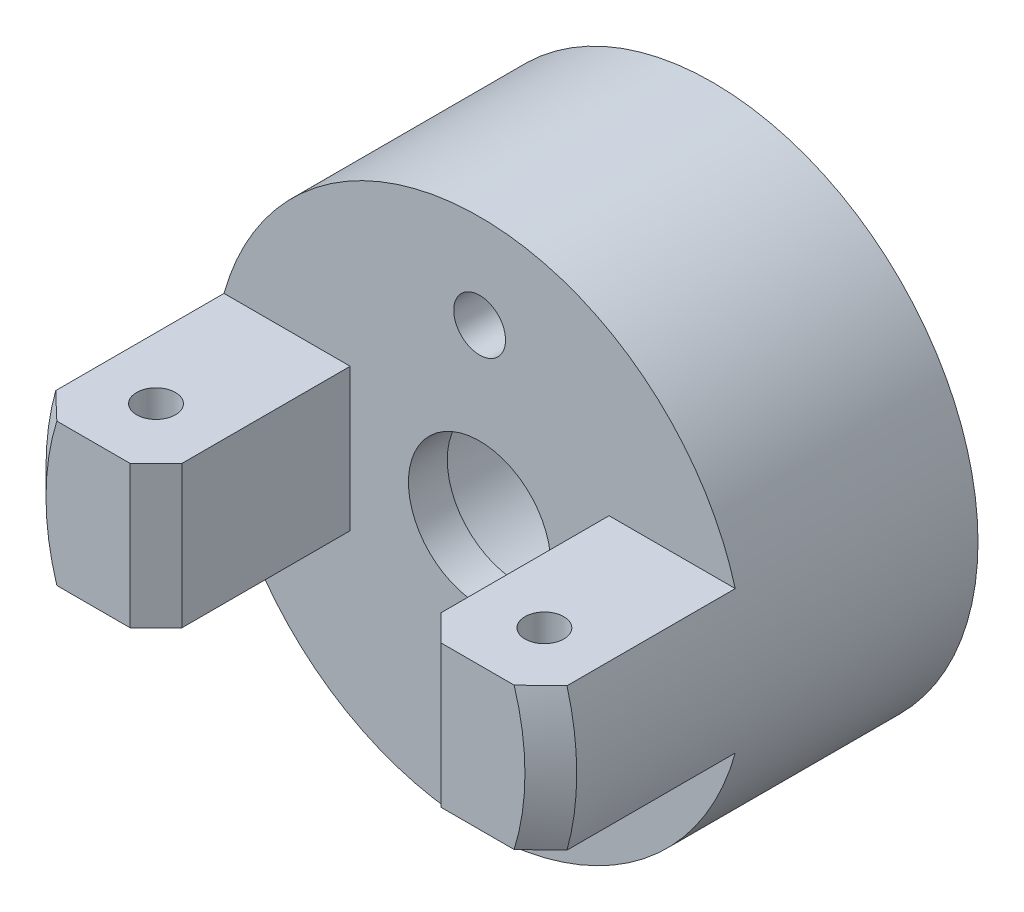
ISO-10303-21;
HEADER;
FILE_DESCRIPTION(('STEP AP214'),'2;1');
FILE_NAME('part.step','',(''),(''),'','','');
FILE_SCHEMA(('AUTOMOTIVE_DESIGN { 1 0 10303 214 1 1 1 1 }'));
ENDSEC;
DATA;
#1=APPLICATION_CONTEXT('core data for automotive mechanical design processes');
#2=APPLICATION_PROTOCOL_DEFINITION('international standard','automotive_design',2000,#1);
#3=PRODUCT_CONTEXT('',#1,'mechanical');
#4=PRODUCT('Part','Part','',(#3));
#5=PRODUCT_RELATED_PRODUCT_CATEGORY('part','',(#4));
#6=PRODUCT_DEFINITION_FORMATION('','',#4);
#7=PRODUCT_DEFINITION_CONTEXT('part definition',#1,'design');
#8=PRODUCT_DEFINITION('design','',#6,#7);
#9=PRODUCT_DEFINITION_SHAPE('','',#8);
#10=(LENGTH_UNIT() NAMED_UNIT(*) SI_UNIT(.MILLI.,.METRE.));
#11=(NAMED_UNIT(*) PLANE_ANGLE_UNIT() SI_UNIT($,.RADIAN.));
#12=(NAMED_UNIT(*) SI_UNIT($,.STERADIAN.) SOLID_ANGLE_UNIT());
#13=UNCERTAINTY_MEASURE_WITH_UNIT(LENGTH_MEASURE(1.E-05),#10,'distance_accuracy_value','');
#14=(GEOMETRIC_REPRESENTATION_CONTEXT(3) GLOBAL_UNCERTAINTY_ASSIGNED_CONTEXT((#13)) GLOBAL_UNIT_ASSIGNED_CONTEXT((#10,
#11,#12)) REPRESENTATION_CONTEXT('',''));
#15=CARTESIAN_POINT('',(0.,0.,0.));
#16=DIRECTION('',(0.,0.,1.));
#17=DIRECTION('',(1.,0.,0.));
#18=AXIS2_PLACEMENT_3D('',#15,#16,#17);
#19=CARTESIAN_POINT('',(0.,0.,0.));
#20=DIRECTION('',(0.,0.,1.));
#21=DIRECTION('',(1.,0.,0.));
#22=AXIS2_PLACEMENT_3D('',#19,#20,#21);
#23=CYLINDRICAL_SURFACE('',#22,5.5);
#24=CARTESIAN_POINT('',(0.,0.,18.));
#25=DIRECTION('',(0.,0.,1.));
#26=DIRECTION('',(1.,0.,0.));
#27=AXIS2_PLACEMENT_3D('',#24,#25,#26);
#28=CIRCLE('',#27,5.5);
#29=CARTESIAN_POINT('',(5.5,0.,18.));
#30=VERTEX_POINT('',#29);
#31=EDGE_CURVE('E339',#30,#30,#28,.T.);
#32=ORIENTED_EDGE('',*,*,#31,.T.);
#33=EDGE_LOOP('',(#32));
#34=FACE_BOUND('',#33,.T.);
#35=CARTESIAN_POINT('',(0.,0.,15.));
#36=DIRECTION('',(0.,0.,-1.));
#37=DIRECTION('',(-1.,0.,0.));
#38=AXIS2_PLACEMENT_3D('',#35,#36,#37);
#39=CIRCLE('',#38,5.5);
#40=CARTESIAN_POINT('',(-5.5,0.,15.));
#41=VERTEX_POINT('',#40);
#42=EDGE_CURVE('E38',#41,#41,#39,.F.);
#43=ORIENTED_EDGE('',*,*,#42,.F.);
#44=EDGE_LOOP('',(#43));
#45=FACE_BOUND('',#44,.T.);
#46=ADVANCED_FACE('F34',(#34,#45),#23,.F.);
#47=CARTESIAN_POINT('',(0.,0.,33.));
#48=DIRECTION('',(0.,0.,1.));
#49=DIRECTION('',(1.,0.,0.));
#50=AXIS2_PLACEMENT_3D('',#47,#48,#49);
#51=PLANE('',#50);
#52=DIRECTION('',(-1.,0.,0.));
#53=VECTOR('',#52,1.);
#54=CARTESIAN_POINT('',(0.,-5.5,33.));
#55=LINE('',#54,#53);
#56=CARTESIAN_POINT('',(17.6635217326557,-5.5,33.));
#57=VERTEX_POINT('',#56);
#58=CARTESIAN_POINT('',(12.,-5.5,33.));
#59=VERTEX_POINT('',#58);
#60=EDGE_CURVE('E188',#57,#59,#55,.T.);
#61=ORIENTED_EDGE('',*,*,#60,.F.);
#62=CARTESIAN_POINT('',(0.,0.,33.));
#63=DIRECTION('',(0.,0.,1.));
#64=DIRECTION('',(1.,0.,0.));
#65=AXIS2_PLACEMENT_3D('',#62,#63,#64);
#66=CIRCLE('',#65,18.5);
#67=CARTESIAN_POINT('',(17.6635217326557,5.5,33.));
#68=VERTEX_POINT('',#67);
#69=EDGE_CURVE('E196',#57,#68,#66,.T.);
#70=ORIENTED_EDGE('',*,*,#69,.T.);
#71=DIRECTION('',(1.,0.,0.));
#72=VECTOR('',#71,1.);
#73=CARTESIAN_POINT('',(10.,5.5,33.));
#74=LINE('',#73,#72);
#75=CARTESIAN_POINT('',(12.,5.5,33.));
#76=VERTEX_POINT('',#75);
#77=EDGE_CURVE('E138',#76,#68,#74,.T.);
#78=ORIENTED_EDGE('',*,*,#77,.F.);
#79=DIRECTION('',(0.,-1.,0.));
#80=VECTOR('',#79,1.);
#81=CARTESIAN_POINT('',(12.,-5.5,33.));
#82=LINE('',#81,#80);
#83=EDGE_CURVE('E194',#76,#59,#82,.T.);
#84=ORIENTED_EDGE('',*,*,#83,.T.);
#85=EDGE_LOOP('',(#61,#70,#78,#84));
#86=FACE_BOUND('',#85,.T.);
#87=ADVANCED_FACE('F275',(#86),#51,.T.);
#88=CARTESIAN_POINT('',(0.,0.,33.));
#89=DIRECTION('',(0.,0.,-1.));
#90=DIRECTION('',(-1.,0.,0.));
#91=AXIS2_PLACEMENT_3D('',#88,#89,#90);
#92=CYLINDRICAL_SURFACE('',#91,20.5);
#93=DIRECTION('',(0.,0.,-1.));
#94=VECTOR('',#93,1.);
#95=CARTESIAN_POINT('',(19.7484176581315,5.5,33.));
#96=LINE('',#95,#94);
#97=CARTESIAN_POINT('',(19.7484176581315,5.5,18.));
#98=VERTEX_POINT('',#97);
#99=CARTESIAN_POINT('',(19.7484176581315,5.5,31.));
#100=VERTEX_POINT('',#99);
#101=EDGE_CURVE('E180',#98,#100,#96,.F.);
#102=ORIENTED_EDGE('',*,*,#101,.T.);
#103=CARTESIAN_POINT('',(0.,0.,31.));
#104=DIRECTION('',(0.,0.,1.));
#105=DIRECTION('',(1.,0.,0.));
#106=AXIS2_PLACEMENT_3D('',#103,#104,#105);
#107=CIRCLE('',#106,20.5);
#108=CARTESIAN_POINT('',(19.7484176581315,-5.5,31.));
#109=VERTEX_POINT('',#108);
#110=EDGE_CURVE('E505',#100,#109,#107,.F.);
#111=ORIENTED_EDGE('',*,*,#110,.T.);
#112=DIRECTION('',(0.,0.,-1.));
#113=VECTOR('',#112,1.);
#114=CARTESIAN_POINT('',(19.7484176581315,-5.5,33.));
#115=LINE('',#114,#113);
#116=CARTESIAN_POINT('',(19.7484176581315,-5.5,18.));
#117=VERTEX_POINT('',#116);
#118=EDGE_CURVE('E178',#109,#117,#115,.T.);
#119=ORIENTED_EDGE('',*,*,#118,.T.);
#120=CARTESIAN_POINT('',(0.,0.,18.));
#121=DIRECTION('',(0.,0.,1.));
#122=DIRECTION('',(1.,0.,0.));
#123=AXIS2_PLACEMENT_3D('',#120,#121,#122);
#124=CIRCLE('',#123,20.5);
#125=CARTESIAN_POINT('',(-19.7484176581315,-5.5,18.));
#126=VERTEX_POINT('',#125);
#127=EDGE_CURVE('E191',#126,#117,#124,.T.);
#128=ORIENTED_EDGE('',*,*,#127,.F.);
#129=DIRECTION('',(0.,0.,-1.));
#130=VECTOR('',#129,1.);
#131=CARTESIAN_POINT('',(-19.7484176581315,-5.5,33.));
#132=LINE('',#131,#130);
#133=CARTESIAN_POINT('',(-19.7484176581315,-5.5,31.));
#134=VERTEX_POINT('',#133);
#135=EDGE_CURVE('E175',#126,#134,#132,.F.);
#136=ORIENTED_EDGE('',*,*,#135,.T.);
#137=CARTESIAN_POINT('',(0.,0.,31.));
#138=DIRECTION('',(0.,0.,1.));
#139=DIRECTION('',(1.,0.,0.));
#140=AXIS2_PLACEMENT_3D('',#137,#138,#139);
#141=CIRCLE('',#140,20.5);
#142=CARTESIAN_POINT('',(-19.7484176581315,5.5,31.));
#143=VERTEX_POINT('',#142);
#144=EDGE_CURVE('E208',#134,#143,#141,.F.);
#145=ORIENTED_EDGE('',*,*,#144,.T.);
#146=DIRECTION('',(0.,0.,-1.));
#147=VECTOR('',#146,1.);
#148=CARTESIAN_POINT('',(-19.7484176581315,5.5,33.));
#149=LINE('',#148,#147);
#150=CARTESIAN_POINT('',(-19.7484176581315,5.5,18.));
#151=VERTEX_POINT('',#150);
#152=EDGE_CURVE('E169',#143,#151,#149,.T.);
#153=ORIENTED_EDGE('',*,*,#152,.T.);
#154=EDGE_CURVE('E136',#98,#151,#124,.T.);
#155=ORIENTED_EDGE('',*,*,#154,.F.);
#156=EDGE_LOOP('',(#102,#111,#119,#128,#136,#145,#153,#155));
#157=FACE_BOUND('',#156,.T.);
#158=CARTESIAN_POINT('',(0.,0.,0.));
#159=DIRECTION('',(0.,0.,1.));
#160=DIRECTION('',(1.,0.,0.));
#161=AXIS2_PLACEMENT_3D('',#158,#159,#160);
#162=CIRCLE('',#161,20.5);
#163=CARTESIAN_POINT('',(20.5,0.,0.));
#164=VERTEX_POINT('',#163);
#165=EDGE_CURVE('E183',#164,#164,#162,.T.);
#166=ORIENTED_EDGE('',*,*,#165,.T.);
#167=EDGE_LOOP('',(#166));
#168=FACE_BOUND('',#167,.T.);
#169=ADVANCED_FACE('F273',(#157,#168),#92,.T.);
#170=DIRECTION('',(1.,0.,0.));
#171=VECTOR('',#170,1.);
#172=CARTESIAN_POINT('',(0.,5.5,33.));
#173=LINE('',#172,#171);
#174=CARTESIAN_POINT('',(-17.6635217326557,5.5,33.));
#175=VERTEX_POINT('',#174);
#176=CARTESIAN_POINT('',(-12.,5.5,33.));
#177=VERTEX_POINT('',#176);
#178=EDGE_CURVE('E186',#175,#177,#173,.T.);
#179=ORIENTED_EDGE('',*,*,#178,.F.);
#180=CARTESIAN_POINT('',(0.,0.,33.));
#181=DIRECTION('',(0.,0.,1.));
#182=DIRECTION('',(1.,0.,0.));
#183=AXIS2_PLACEMENT_3D('',#180,#181,#182);
#184=CIRCLE('',#183,18.5);
#185=CARTESIAN_POINT('',(-17.6635217326557,-5.5,33.));
#186=VERTEX_POINT('',#185);
#187=EDGE_CURVE('E243',#175,#186,#184,.T.);
#188=ORIENTED_EDGE('',*,*,#187,.T.);
#189=DIRECTION('',(-1.,0.,0.));
#190=VECTOR('',#189,1.);
#191=CARTESIAN_POINT('',(-25.1522951522951,-5.5,33.));
#192=LINE('',#191,#190);
#193=CARTESIAN_POINT('',(-12.,-5.5,33.));
#194=VERTEX_POINT('',#193);
#195=EDGE_CURVE('E160',#194,#186,#192,.T.);
#196=ORIENTED_EDGE('',*,*,#195,.F.);
#197=DIRECTION('',(0.,1.,0.));
#198=VECTOR('',#197,1.);
#199=CARTESIAN_POINT('',(-12.,5.5,33.));
#200=LINE('',#199,#198);
#201=EDGE_CURVE('E240',#194,#177,#200,.T.);
#202=ORIENTED_EDGE('',*,*,#201,.T.);
#203=EDGE_LOOP('',(#179,#188,#196,#202));
#204=FACE_BOUND('',#203,.T.);
#205=ADVANCED_FACE('F269',(#204),#51,.T.);
#206=CARTESIAN_POINT('',(0.,0.,0.));
#207=DIRECTION('',(0.,0.,1.));
#208=DIRECTION('',(1.,0.,0.));
#209=AXIS2_PLACEMENT_3D('',#206,#207,#208);
#210=PLANE('',#209);
#211=CARTESIAN_POINT('',(0.,0.,0.));
#212=DIRECTION('',(0.,0.,-1.));
#213=DIRECTION('',(-1.,0.,0.));
#214=AXIS2_PLACEMENT_3D('',#211,#212,#213);
#215=CIRCLE('',#214,7.5);
#216=CARTESIAN_POINT('',(-7.5,0.,0.));
#217=VERTEX_POINT('',#216);
#218=EDGE_CURVE('E341',#217,#217,#215,.T.);
#219=ORIENTED_EDGE('',*,*,#218,.F.);
#220=EDGE_LOOP('',(#219));
#221=FACE_BOUND('',#220,.T.);
#222=CARTESIAN_POINT('',(0.,-13.25,0.));
#223=DIRECTION('',(0.,0.,1.));
#224=DIRECTION('',(1.,0.,0.));
#225=AXIS2_PLACEMENT_3D('',#222,#223,#224);
#226=CIRCLE('',#225,2.);
#227=CARTESIAN_POINT('',(2.,-13.25,0.));
#228=VERTEX_POINT('',#227);
#229=EDGE_CURVE('E321',#228,#228,#226,.T.);
#230=ORIENTED_EDGE('',*,*,#229,.T.);
#231=EDGE_LOOP('',(#230));
#232=FACE_BOUND('',#231,.T.);
#233=CARTESIAN_POINT('',(0.,13.25,0.));
#234=DIRECTION('',(0.,0.,1.));
#235=DIRECTION('',(1.,0.,0.));
#236=AXIS2_PLACEMENT_3D('',#233,#234,#235);
#237=CIRCLE('',#236,2.);
#238=CARTESIAN_POINT('',(2.,13.25,0.));
#239=VERTEX_POINT('',#238);
#240=EDGE_CURVE('E163',#239,#239,#237,.T.);
#241=ORIENTED_EDGE('',*,*,#240,.T.);
#242=EDGE_LOOP('',(#241));
#243=FACE_BOUND('',#242,.T.);
#244=ORIENTED_EDGE('',*,*,#165,.F.);
#245=EDGE_LOOP('',(#244));
#246=FACE_BOUND('',#245,.T.);
#247=ADVANCED_FACE('F272',(#221,#232,#243,#246),#210,.F.);
#248=CARTESIAN_POINT('',(-29.056757359865,-27.5157232704402,18.));
#249=DIRECTION('',(0.,0.,1.));
#250=DIRECTION('',(1.,0.,0.));
#251=AXIS2_PLACEMENT_3D('',#248,#249,#250);
#252=PLANE('',#251);
#253=ORIENTED_EDGE('',*,*,#31,.F.);
#254=EDGE_LOOP('',(#253));
#255=FACE_BOUND('',#254,.T.);
#256=CARTESIAN_POINT('',(0.,-13.25,18.));
#257=DIRECTION('',(0.,0.,1.));
#258=DIRECTION('',(1.,0.,0.));
#259=AXIS2_PLACEMENT_3D('',#256,#257,#258);
#260=CIRCLE('',#259,2.);
#261=CARTESIAN_POINT('',(2.,-13.25,18.));
#262=VERTEX_POINT('',#261);
#263=EDGE_CURVE('E324',#262,#262,#260,.T.);
#264=ORIENTED_EDGE('',*,*,#263,.F.);
#265=EDGE_LOOP('',(#264));
#266=FACE_BOUND('',#265,.T.);
#267=CARTESIAN_POINT('',(0.,13.25,18.));
#268=DIRECTION('',(0.,0.,1.));
#269=DIRECTION('',(1.,0.,0.));
#270=AXIS2_PLACEMENT_3D('',#267,#268,#269);
#271=CIRCLE('',#270,2.);
#272=CARTESIAN_POINT('',(2.,13.25,18.));
#273=VERTEX_POINT('',#272);
#274=EDGE_CURVE('E319',#273,#273,#271,.T.);
#275=ORIENTED_EDGE('',*,*,#274,.F.);
#276=EDGE_LOOP('',(#275));
#277=FACE_BOUND('',#276,.T.);
#278=ORIENTED_EDGE('',*,*,#154,.T.);
#279=DIRECTION('',(1.,0.,0.));
#280=VECTOR('',#279,1.);
#281=CARTESIAN_POINT('',(-29.056757359865,5.5,18.));
#282=LINE('',#281,#280);
#283=CARTESIAN_POINT('',(-10.,5.5,18.));
#284=VERTEX_POINT('',#283);
#285=EDGE_CURVE('E129',#151,#284,#282,.T.);
#286=ORIENTED_EDGE('',*,*,#285,.T.);
#287=DIRECTION('',(0.,-1.,0.));
#288=VECTOR('',#287,1.);
#289=CARTESIAN_POINT('',(-10.,5.5,18.));
#290=LINE('',#289,#288);
#291=CARTESIAN_POINT('',(-10.,-5.5,18.));
#292=VERTEX_POINT('',#291);
#293=EDGE_CURVE('E133',#284,#292,#290,.T.);
#294=ORIENTED_EDGE('',*,*,#293,.T.);
#295=DIRECTION('',(-1.,0.,0.));
#296=VECTOR('',#295,1.);
#297=CARTESIAN_POINT('',(-25.1522951522951,-5.5,18.));
#298=LINE('',#297,#296);
#299=EDGE_CURVE('E149',#292,#126,#298,.T.);
#300=ORIENTED_EDGE('',*,*,#299,.T.);
#301=ORIENTED_EDGE('',*,*,#127,.T.);
#302=DIRECTION('',(-1.,0.,0.));
#303=VECTOR('',#302,1.);
#304=CARTESIAN_POINT('',(10.,-5.5,18.));
#305=LINE('',#304,#303);
#306=CARTESIAN_POINT('',(10.,-5.5,18.));
#307=VERTEX_POINT('',#306);
#308=EDGE_CURVE('E151',#117,#307,#305,.T.);
#309=ORIENTED_EDGE('',*,*,#308,.T.);
#310=DIRECTION('',(0.,1.,0.));
#311=VECTOR('',#310,1.);
#312=CARTESIAN_POINT('',(10.,5.5,18.));
#313=LINE('',#312,#311);
#314=CARTESIAN_POINT('',(10.,5.5,18.));
#315=VERTEX_POINT('',#314);
#316=EDGE_CURVE('E156',#307,#315,#313,.T.);
#317=ORIENTED_EDGE('',*,*,#316,.T.);
#318=DIRECTION('',(1.,0.,0.));
#319=VECTOR('',#318,1.);
#320=CARTESIAN_POINT('',(10.,5.5,18.));
#321=LINE('',#320,#319);
#322=EDGE_CURVE('E144',#315,#98,#321,.T.);
#323=ORIENTED_EDGE('',*,*,#322,.T.);
#324=EDGE_LOOP('',(#278,#286,#294,#300,#301,#309,#317,#323));
#325=FACE_BOUND('',#324,.T.);
#326=ADVANCED_FACE('F130',(#255,#266,#277,#325),#252,.T.);
#327=CARTESIAN_POINT('',(10.,5.5,18.));
#328=DIRECTION('',(0.,-1.,0.));
#329=DIRECTION('',(0.,0.,-1.));
#330=AXIS2_PLACEMENT_3D('',#327,#328,#329);
#331=PLANE('',#330);
#332=CARTESIAN_POINT('',(15.,5.5,28.));
#333=DIRECTION('',(0.,-1.,0.));
#334=DIRECTION('',(0.,0.,-1.));
#335=AXIS2_PLACEMENT_3D('',#332,#333,#334);
#336=CIRCLE('',#335,1.5);
#337=CARTESIAN_POINT('',(15.,5.5,26.5));
#338=VERTEX_POINT('',#337);
#339=EDGE_CURVE('E333',#338,#338,#336,.T.);
#340=ORIENTED_EDGE('',*,*,#339,.T.);
#341=EDGE_LOOP('',(#340));
#342=FACE_BOUND('',#341,.T.);
#343=ORIENTED_EDGE('',*,*,#77,.T.);
#344=CARTESIAN_POINT('',(17.6635217326557,5.5,33.));
#345=CARTESIAN_POINT('',(17.8376536241762,5.5,32.8337408729626));
#346=CARTESIAN_POINT('',(18.0116775804281,5.5,32.6673687433211));
#347=CARTESIAN_POINT('',(18.3595251820386,5.5,32.3344156355697));
#348=CARTESIAN_POINT('',(18.5333488276442,5.5,32.167834657718));
#349=CARTESIAN_POINT('',(18.880811767016,5.5,31.834480628917));
#350=CARTESIAN_POINT('',(19.0544510608146,5.5,31.6677075780013));
#351=CARTESIAN_POINT('',(19.4015590175043,5.5,31.333983568453));
#352=CARTESIAN_POINT('',(19.5750276801845,5.5,31.167032609601));
#353=CARTESIAN_POINT('',(19.7484176581315,5.5,31.));
#354=B_SPLINE_CURVE_WITH_KNOTS('',3,(#344,#345,#346,#347,#348,#349,#350,#351,#352,#353),
.UNSPECIFIED.,.F.,.F.,(4,2,2,2,4),(0.,0.722271403796044,1.44454191571395,2.16681230059588,
2.88908357710672),.UNSPECIFIED.);
#355=EDGE_CURVE('E201',#68,#100,#354,.T.);
#356=ORIENTED_EDGE('',*,*,#355,.T.);
#357=ORIENTED_EDGE('',*,*,#101,.F.);
#358=ORIENTED_EDGE('',*,*,#322,.F.);
#359=DIRECTION('',(0.,0.,1.));
#360=VECTOR('',#359,1.);
#361=CARTESIAN_POINT('',(10.,5.5,18.));
#362=LINE('',#361,#360);
#363=CARTESIAN_POINT('',(10.,5.5,31.));
#364=VERTEX_POINT('',#363);
#365=EDGE_CURVE('E166',#315,#364,#362,.T.);
#366=ORIENTED_EDGE('',*,*,#365,.T.);
#367=DIRECTION('',(0.707106781186548,0.,0.707106781186547));
#368=VECTOR('',#367,1.);
#369=CARTESIAN_POINT('',(10.,5.5,31.));
#370=LINE('',#369,#368);
#371=EDGE_CURVE('E199',#364,#76,#370,.T.);
#372=ORIENTED_EDGE('',*,*,#371,.T.);
#373=EDGE_LOOP('',(#343,#356,#357,#358,#366,#372));
#374=FACE_BOUND('',#373,.T.);
#375=ADVANCED_FACE('F214',(#342,#374),#331,.F.);
#376=CARTESIAN_POINT('',(10.,-5.5,18.));
#377=DIRECTION('',(0.,1.,0.));
#378=DIRECTION('',(0.,0.,1.));
#379=AXIS2_PLACEMENT_3D('',#376,#377,#378);
#380=PLANE('',#379);
#381=CARTESIAN_POINT('',(15.,-5.5,28.));
#382=DIRECTION('',(0.,-1.,0.));
#383=DIRECTION('',(1.,0.,0.));
#384=AXIS2_PLACEMENT_3D('',#381,#382,#383);
#385=CIRCLE('',#384,1.5);
#386=CARTESIAN_POINT('',(16.5,-5.5,28.));
#387=VERTEX_POINT('',#386);
#388=EDGE_CURVE('E336',#387,#387,#385,.T.);
#389=ORIENTED_EDGE('',*,*,#388,.F.);
#390=EDGE_LOOP('',(#389));
#391=FACE_BOUND('',#390,.T.);
#392=ORIENTED_EDGE('',*,*,#118,.F.);
#393=CARTESIAN_POINT('',(19.7484176581315,-5.5,31.));
#394=CARTESIAN_POINT('',(19.5750276801845,-5.5,31.167032609601));
#395=CARTESIAN_POINT('',(19.4015590175043,-5.5,31.333983568453));
#396=CARTESIAN_POINT('',(19.0544510608146,-5.5,31.6677075780013));
#397=CARTESIAN_POINT('',(18.880811767016,-5.5,31.834480628917));
#398=CARTESIAN_POINT('',(18.5333488276442,-5.5,32.167834657718));
#399=CARTESIAN_POINT('',(18.3595251820386,-5.5,32.3344156355697));
#400=CARTESIAN_POINT('',(18.0116775804281,-5.5,32.6673687433211));
#401=CARTESIAN_POINT('',(17.8376536241762,-5.5,32.8337408729626));
#402=CARTESIAN_POINT('',(17.6635217326557,-5.5,33.));
#403=B_SPLINE_CURVE_WITH_KNOTS('',3,(#393,#394,#395,#396,#397,#398,#399,#400,#401,#402),
.UNSPECIFIED.,.F.,.F.,(4,2,2,2,4),(0.,0.72227127651084,1.44454166139278,2.16681217331067,
2.88908357710672),.UNSPECIFIED.);
#404=EDGE_CURVE('E234',#109,#57,#403,.T.);
#405=ORIENTED_EDGE('',*,*,#404,.T.);
#406=ORIENTED_EDGE('',*,*,#60,.T.);
#407=DIRECTION('',(-0.707106781186548,0.,-0.707106781186547));
#408=VECTOR('',#407,1.);
#409=CARTESIAN_POINT('',(10.,-5.5,31.));
#410=LINE('',#409,#408);
#411=CARTESIAN_POINT('',(10.,-5.5,31.));
#412=VERTEX_POINT('',#411);
#413=EDGE_CURVE('E241',#59,#412,#410,.T.);
#414=ORIENTED_EDGE('',*,*,#413,.T.);
#415=DIRECTION('',(0.,0.,1.));
#416=VECTOR('',#415,1.);
#417=CARTESIAN_POINT('',(10.,-5.5,18.));
#418=LINE('',#417,#416);
#419=EDGE_CURVE('E170',#307,#412,#418,.T.);
#420=ORIENTED_EDGE('',*,*,#419,.F.);
#421=ORIENTED_EDGE('',*,*,#308,.F.);
#422=EDGE_LOOP('',(#392,#405,#406,#414,#420,#421));
#423=FACE_BOUND('',#422,.T.);
#424=ADVANCED_FACE('F219',(#391,#423),#380,.F.);
#425=CARTESIAN_POINT('',(-25.1522951522951,-5.5,18.));
#426=DIRECTION('',(0.,1.,0.));
#427=DIRECTION('',(-1.,0.,0.));
#428=AXIS2_PLACEMENT_3D('',#425,#426,#427);
#429=PLANE('',#428);
#430=CARTESIAN_POINT('',(-15.,-5.5,28.));
#431=DIRECTION('',(0.,-1.,0.));
#432=DIRECTION('',(1.,0.,0.));
#433=AXIS2_PLACEMENT_3D('',#430,#431,#432);
#434=CIRCLE('',#433,1.5);
#435=CARTESIAN_POINT('',(-13.5,-5.5,28.));
#436=VERTEX_POINT('',#435);
#437=EDGE_CURVE('E330',#436,#436,#434,.T.);
#438=ORIENTED_EDGE('',*,*,#437,.F.);
#439=EDGE_LOOP('',(#438));
#440=FACE_BOUND('',#439,.T.);
#441=ORIENTED_EDGE('',*,*,#195,.T.);
#442=CARTESIAN_POINT('',(-17.6635217326557,-5.5,33.));
#443=CARTESIAN_POINT('',(-17.8376536241762,-5.5,32.8337408729626));
#444=CARTESIAN_POINT('',(-18.0116775804281,-5.5,32.6673687433211));
#445=CARTESIAN_POINT('',(-18.3595251820386,-5.5,32.3344156355697));
#446=CARTESIAN_POINT('',(-18.5333488276442,-5.5,32.167834657718));
#447=CARTESIAN_POINT('',(-18.880811767016,-5.5,31.834480628917));
#448=CARTESIAN_POINT('',(-19.0544510608146,-5.5,31.6677075780013));
#449=CARTESIAN_POINT('',(-19.4015590175043,-5.5,31.333983568453));
#450=CARTESIAN_POINT('',(-19.5750276801845,-5.5,31.167032609601));
#451=CARTESIAN_POINT('',(-19.7484176581315,-5.5,31.));
#452=B_SPLINE_CURVE_WITH_KNOTS('',3,(#442,#443,#444,#445,#446,#447,#448,#449,#450,#451),
.UNSPECIFIED.,.F.,.F.,(4,2,2,2,4),(0.,0.722271403796044,1.44454191571395,2.16681230059588,
2.88908357710672),.UNSPECIFIED.);
#453=EDGE_CURVE('E247',#186,#134,#452,.T.);
#454=ORIENTED_EDGE('',*,*,#453,.T.);
#455=ORIENTED_EDGE('',*,*,#135,.F.);
#456=ORIENTED_EDGE('',*,*,#299,.F.);
#457=DIRECTION('',(0.,0.,1.));
#458=VECTOR('',#457,1.);
#459=CARTESIAN_POINT('',(-10.,-5.5,18.));
#460=LINE('',#459,#458);
#461=CARTESIAN_POINT('',(-10.,-5.5,31.));
#462=VERTEX_POINT('',#461);
#463=EDGE_CURVE('E143',#292,#462,#460,.T.);
#464=ORIENTED_EDGE('',*,*,#463,.T.);
#465=DIRECTION('',(-0.707106781186547,0.,0.707106781186548));
#466=VECTOR('',#465,1.);
#467=CARTESIAN_POINT('',(-10.,-5.5,31.));
#468=LINE('',#467,#466);
#469=EDGE_CURVE('E59',#462,#194,#468,.T.);
#470=ORIENTED_EDGE('',*,*,#469,.T.);
#471=EDGE_LOOP('',(#441,#454,#455,#456,#464,#470));
#472=FACE_BOUND('',#471,.T.);
#473=ADVANCED_FACE('F229',(#440,#472),#429,.F.);
#474=CARTESIAN_POINT('',(-29.056757359865,5.5,18.));
#475=DIRECTION('',(0.,-1.,0.));
#476=DIRECTION('',(0.,0.,-1.));
#477=AXIS2_PLACEMENT_3D('',#474,#475,#476);
#478=PLANE('',#477);
#479=CARTESIAN_POINT('',(-15.,5.5,28.));
#480=DIRECTION('',(0.,-1.,0.));
#481=DIRECTION('',(0.,0.,-1.));
#482=AXIS2_PLACEMENT_3D('',#479,#480,#481);
#483=CIRCLE('',#482,1.5);
#484=CARTESIAN_POINT('',(-15.,5.5,26.5));
#485=VERTEX_POINT('',#484);
#486=EDGE_CURVE('E328',#485,#485,#483,.T.);
#487=ORIENTED_EDGE('',*,*,#486,.T.);
#488=EDGE_LOOP('',(#487));
#489=FACE_BOUND('',#488,.T.);
#490=ORIENTED_EDGE('',*,*,#152,.F.);
#491=CARTESIAN_POINT('',(-19.7484176581315,5.5,31.));
#492=CARTESIAN_POINT('',(-19.5750276801845,5.5,31.167032609601));
#493=CARTESIAN_POINT('',(-19.4015590175043,5.5,31.333983568453));
#494=CARTESIAN_POINT('',(-19.0544510608146,5.5,31.6677075780013));
#495=CARTESIAN_POINT('',(-18.880811767016,5.5,31.834480628917));
#496=CARTESIAN_POINT('',(-18.5333488276442,5.5,32.167834657718));
#497=CARTESIAN_POINT('',(-18.3595251820386,5.5,32.3344156355697));
#498=CARTESIAN_POINT('',(-18.0116775804281,5.5,32.6673687433211));
#499=CARTESIAN_POINT('',(-17.8376536241762,5.5,32.8337408729626));
#500=CARTESIAN_POINT('',(-17.6635217326557,5.5,33.));
#501=B_SPLINE_CURVE_WITH_KNOTS('',3,(#491,#492,#493,#494,#495,#496,#497,#498,#499,#500),
.UNSPECIFIED.,.F.,.F.,(4,2,2,2,4),(0.,0.72227127651084,1.44454166139278,2.16681217331067,
2.88908357710672),.UNSPECIFIED.);
#502=EDGE_CURVE('E259',#143,#175,#501,.T.);
#503=ORIENTED_EDGE('',*,*,#502,.T.);
#504=ORIENTED_EDGE('',*,*,#178,.T.);
#505=DIRECTION('',(0.707106781186547,0.,-0.707106781186548));
#506=VECTOR('',#505,1.);
#507=CARTESIAN_POINT('',(-10.,5.5,31.));
#508=LINE('',#507,#506);
#509=CARTESIAN_POINT('',(-10.,5.5,31.));
#510=VERTEX_POINT('',#509);
#511=EDGE_CURVE('E51',#177,#510,#508,.T.);
#512=ORIENTED_EDGE('',*,*,#511,.T.);
#513=DIRECTION('',(0.,0.,1.));
#514=VECTOR('',#513,1.);
#515=CARTESIAN_POINT('',(-10.,5.5,18.));
#516=LINE('',#515,#514);
#517=EDGE_CURVE('E140',#284,#510,#516,.T.);
#518=ORIENTED_EDGE('',*,*,#517,.F.);
#519=ORIENTED_EDGE('',*,*,#285,.F.);
#520=EDGE_LOOP('',(#490,#503,#504,#512,#518,#519));
#521=FACE_BOUND('',#520,.T.);
#522=ADVANCED_FACE('F141',(#489,#521),#478,.F.);
#523=CARTESIAN_POINT('',(10.,5.5,18.));
#524=DIRECTION('',(1.,0.,0.));
#525=DIRECTION('',(0.,1.,0.));
#526=AXIS2_PLACEMENT_3D('',#523,#524,#525);
#527=PLANE('',#526);
#528=ORIENTED_EDGE('',*,*,#419,.T.);
#529=DIRECTION('',(0.,1.,0.));
#530=VECTOR('',#529,1.);
#531=CARTESIAN_POINT('',(10.,5.5,31.));
#532=LINE('',#531,#530);
#533=EDGE_CURVE('E11',#412,#364,#532,.T.);
#534=ORIENTED_EDGE('',*,*,#533,.T.);
#535=ORIENTED_EDGE('',*,*,#365,.F.);
#536=ORIENTED_EDGE('',*,*,#316,.F.);
#537=EDGE_LOOP('',(#528,#534,#535,#536));
#538=FACE_BOUND('',#537,.T.);
#539=ADVANCED_FACE('F222',(#538),#527,.F.);
#540=CARTESIAN_POINT('',(-10.,5.5,18.));
#541=DIRECTION('',(-1.,0.,0.));
#542=DIRECTION('',(0.,-1.,0.));
#543=AXIS2_PLACEMENT_3D('',#540,#541,#542);
#544=PLANE('',#543);
#545=ORIENTED_EDGE('',*,*,#517,.T.);
#546=DIRECTION('',(0.,-1.,0.));
#547=VECTOR('',#546,1.);
#548=CARTESIAN_POINT('',(-10.,-5.5,31.));
#549=LINE('',#548,#547);
#550=EDGE_CURVE('E43',#510,#462,#549,.T.);
#551=ORIENTED_EDGE('',*,*,#550,.T.);
#552=ORIENTED_EDGE('',*,*,#463,.F.);
#553=ORIENTED_EDGE('',*,*,#293,.F.);
#554=EDGE_LOOP('',(#545,#551,#552,#553));
#555=FACE_BOUND('',#554,.T.);
#556=ADVANCED_FACE('F146',(#555),#544,.F.);
#557=CARTESIAN_POINT('',(0.,13.25,0.));
#558=DIRECTION('',(0.,0.,1.));
#559=DIRECTION('',(1.,0.,0.));
#560=AXIS2_PLACEMENT_3D('',#557,#558,#559);
#561=CYLINDRICAL_SURFACE('',#560,2.);
#562=ORIENTED_EDGE('',*,*,#240,.F.);
#563=EDGE_LOOP('',(#562));
#564=FACE_BOUND('',#563,.T.);
#565=ORIENTED_EDGE('',*,*,#274,.T.);
#566=EDGE_LOOP('',(#565));
#567=FACE_BOUND('',#566,.T.);
#568=ADVANCED_FACE('F307',(#564,#567),#561,.F.);
#569=CARTESIAN_POINT('',(0.,-13.25,0.));
#570=DIRECTION('',(0.,0.,1.));
#571=DIRECTION('',(1.,0.,0.));
#572=AXIS2_PLACEMENT_3D('',#569,#570,#571);
#573=CYLINDRICAL_SURFACE('',#572,2.);
#574=ORIENTED_EDGE('',*,*,#229,.F.);
#575=EDGE_LOOP('',(#574));
#576=FACE_BOUND('',#575,.T.);
#577=ORIENTED_EDGE('',*,*,#263,.T.);
#578=EDGE_LOOP('',(#577));
#579=FACE_BOUND('',#578,.T.);
#580=ADVANCED_FACE('F305',(#576,#579),#573,.F.);
#581=CARTESIAN_POINT('',(0.,0.,33.));
#582=DIRECTION('',(0.,0.,-1.));
#583=DIRECTION('',(-1.,0.,0.));
#584=AXIS2_PLACEMENT_3D('',#581,#582,#583);
#585=CONICAL_SURFACE('',#584,18.5,0.785398163397447);
#586=ORIENTED_EDGE('',*,*,#404,.F.);
#587=ORIENTED_EDGE('',*,*,#110,.F.);
#588=ORIENTED_EDGE('',*,*,#355,.F.);
#589=ORIENTED_EDGE('',*,*,#69,.F.);
#590=EDGE_LOOP('',(#586,#587,#588,#589));
#591=FACE_BOUND('',#590,.T.);
#592=ADVANCED_FACE('F210',(#591),#585,.T.);
#593=CARTESIAN_POINT('',(0.,0.,33.));
#594=DIRECTION('',(0.,0.,-1.));
#595=DIRECTION('',(-1.,0.,0.));
#596=AXIS2_PLACEMENT_3D('',#593,#594,#595);
#597=CONICAL_SURFACE('',#596,18.5,0.785398163397447);
#598=ORIENTED_EDGE('',*,*,#502,.F.);
#599=ORIENTED_EDGE('',*,*,#144,.F.);
#600=ORIENTED_EDGE('',*,*,#453,.F.);
#601=ORIENTED_EDGE('',*,*,#187,.F.);
#602=EDGE_LOOP('',(#598,#599,#600,#601));
#603=FACE_BOUND('',#602,.T.);
#604=ADVANCED_FACE('F253',(#603),#597,.T.);
#605=CARTESIAN_POINT('',(-10.,5.5,31.));
#606=DIRECTION('',(0.707106781186548,0.,0.707106781186547));
#607=DIRECTION('',(0.707106781186547,0.,-0.707106781186548));
#608=AXIS2_PLACEMENT_3D('',#605,#606,#607);
#609=PLANE('',#608);
#610=ORIENTED_EDGE('',*,*,#511,.F.);
#611=ORIENTED_EDGE('',*,*,#201,.F.);
#612=ORIENTED_EDGE('',*,*,#469,.F.);
#613=ORIENTED_EDGE('',*,*,#550,.F.);
#614=EDGE_LOOP('',(#610,#611,#612,#613));
#615=FACE_BOUND('',#614,.T.);
#616=ADVANCED_FACE('F256',(#615),#609,.T.);
#617=CARTESIAN_POINT('',(10.,5.5,31.));
#618=DIRECTION('',(-0.707106781186547,0.,0.707106781186548));
#619=DIRECTION('',(0.707106781186548,0.,0.707106781186547));
#620=AXIS2_PLACEMENT_3D('',#617,#618,#619);
#621=PLANE('',#620);
#622=ORIENTED_EDGE('',*,*,#413,.F.);
#623=ORIENTED_EDGE('',*,*,#83,.F.);
#624=ORIENTED_EDGE('',*,*,#371,.F.);
#625=ORIENTED_EDGE('',*,*,#533,.F.);
#626=EDGE_LOOP('',(#622,#623,#624,#625));
#627=FACE_BOUND('',#626,.T.);
#628=ADVANCED_FACE('F36',(#627),#621,.T.);
#629=CARTESIAN_POINT('',(-15.,9.5,28.));
#630=DIRECTION('',(0.,-1.,0.));
#631=DIRECTION('',(1.,0.,0.));
#632=AXIS2_PLACEMENT_3D('',#629,#630,#631);
#633=CYLINDRICAL_SURFACE('',#632,1.5);
#634=ORIENTED_EDGE('',*,*,#437,.T.);
#635=EDGE_LOOP('',(#634));
#636=FACE_BOUND('',#635,.T.);
#637=ORIENTED_EDGE('',*,*,#486,.F.);
#638=EDGE_LOOP('',(#637));
#639=FACE_BOUND('',#638,.T.);
#640=ADVANCED_FACE('F300',(#636,#639),#633,.F.);
#641=CARTESIAN_POINT('',(15.,9.5,28.));
#642=DIRECTION('',(0.,-1.,0.));
#643=DIRECTION('',(1.,0.,0.));
#644=AXIS2_PLACEMENT_3D('',#641,#642,#643);
#645=CYLINDRICAL_SURFACE('',#644,1.5);
#646=ORIENTED_EDGE('',*,*,#388,.T.);
#647=EDGE_LOOP('',(#646));
#648=FACE_BOUND('',#647,.T.);
#649=ORIENTED_EDGE('',*,*,#339,.F.);
#650=EDGE_LOOP('',(#649));
#651=FACE_BOUND('',#650,.T.);
#652=ADVANCED_FACE('F296',(#648,#651),#645,.F.);
#653=CARTESIAN_POINT('',(0.,0.,15.));
#654=DIRECTION('',(0.,0.,-1.));
#655=DIRECTION('',(-1.,0.,0.));
#656=AXIS2_PLACEMENT_3D('',#653,#654,#655);
#657=PLANE('',#656);
#658=CARTESIAN_POINT('',(0.,0.,15.));
#659=DIRECTION('',(0.,0.,-1.));
#660=DIRECTION('',(-1.,0.,0.));
#661=AXIS2_PLACEMENT_3D('',#658,#659,#660);
#662=CIRCLE('',#661,7.5);
#663=CARTESIAN_POINT('',(-7.5,0.,15.));
#664=VERTEX_POINT('',#663);
#665=EDGE_CURVE('E344',#664,#664,#662,.T.);
#666=ORIENTED_EDGE('',*,*,#665,.T.);
#667=EDGE_LOOP('',(#666));
#668=FACE_BOUND('',#667,.T.);
#669=ORIENTED_EDGE('',*,*,#42,.T.);
#670=EDGE_LOOP('',(#669));
#671=FACE_BOUND('',#670,.T.);
#672=ADVANCED_FACE('F299',(#668,#671),#657,.T.);
#673=CARTESIAN_POINT('',(0.,0.,15.));
#674=DIRECTION('',(0.,0.,-1.));
#675=DIRECTION('',(-1.,0.,0.));
#676=AXIS2_PLACEMENT_3D('',#673,#674,#675);
#677=CYLINDRICAL_SURFACE('',#676,7.5);
#678=ORIENTED_EDGE('',*,*,#665,.F.);
#679=EDGE_LOOP('',(#678));
#680=FACE_BOUND('',#679,.T.);
#681=ORIENTED_EDGE('',*,*,#218,.T.);
#682=EDGE_LOOP('',(#681));
#683=FACE_BOUND('',#682,.T.);
#684=ADVANCED_FACE('F294',(#680,#683),#677,.F.);
#685=CLOSED_SHELL('',(#46,#87,#169,#205,#247,#326,#375,#424,#473,#522,#539,#556,#568,#580,#592,
#604,#616,#628,#640,#652,#672,#684));
#686=MANIFOLD_SOLID_BREP('B2',#685);
#687=ADVANCED_BREP_SHAPE_REPRESENTATION('',(#18,#686),#14);
#688=SHAPE_DEFINITION_REPRESENTATION(#9,#687);
ENDSEC;
END-ISO-10303-21;
